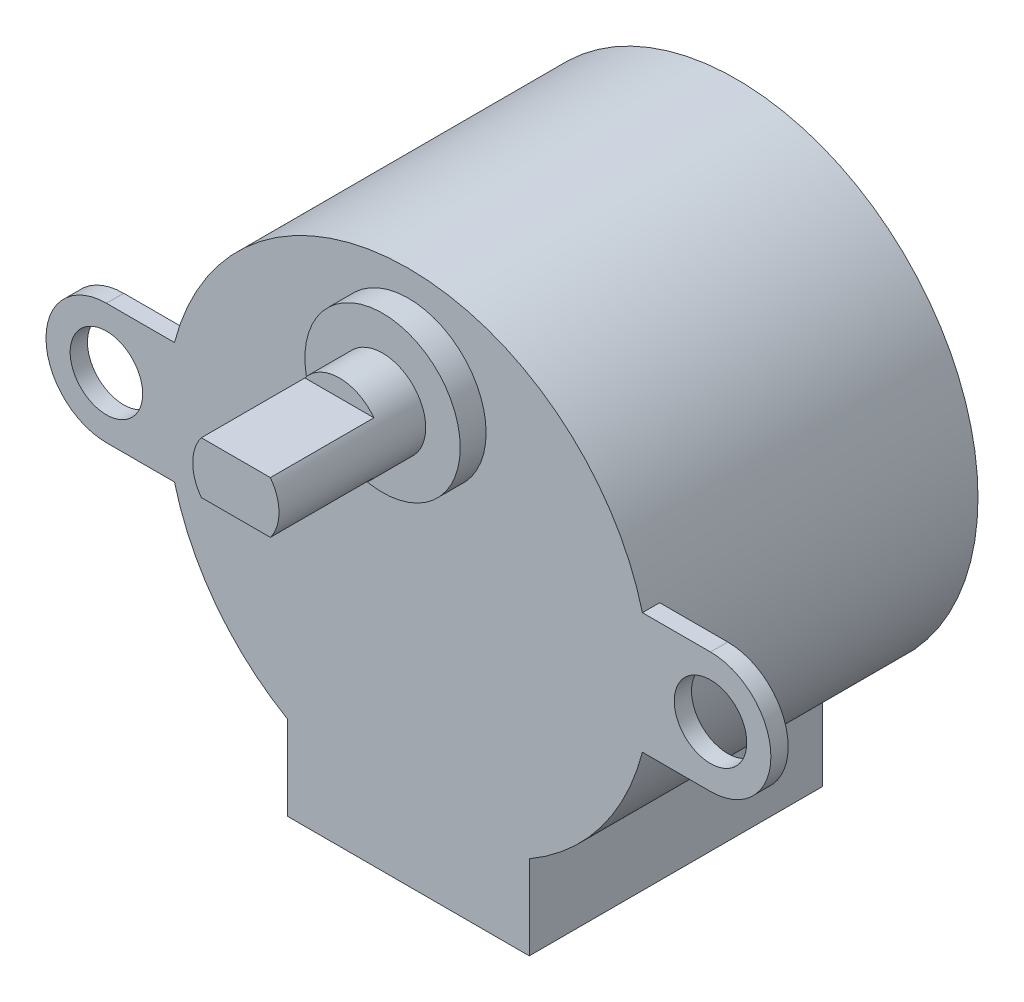
ISO-10303-21;
HEADER;
FILE_DESCRIPTION(('STEP AP214'),'2;1');
FILE_NAME('part.step','',(''),(''),'','','');
FILE_SCHEMA(('AUTOMOTIVE_DESIGN { 1 0 10303 214 1 1 1 1 }'));
ENDSEC;
DATA;
#1=APPLICATION_CONTEXT('core data for automotive mechanical design processes');
#2=APPLICATION_PROTOCOL_DEFINITION('international standard','automotive_design',2000,#1);
#3=PRODUCT_CONTEXT('',#1,'mechanical');
#4=PRODUCT('Part','Part','',(#3));
#5=PRODUCT_RELATED_PRODUCT_CATEGORY('part','',(#4));
#6=PRODUCT_DEFINITION_FORMATION('','',#4);
#7=PRODUCT_DEFINITION_CONTEXT('part definition',#1,'design');
#8=PRODUCT_DEFINITION('design','',#6,#7);
#9=PRODUCT_DEFINITION_SHAPE('','',#8);
#10=(LENGTH_UNIT() NAMED_UNIT(*) SI_UNIT(.MILLI.,.METRE.));
#11=(NAMED_UNIT(*) PLANE_ANGLE_UNIT() SI_UNIT($,.RADIAN.));
#12=(NAMED_UNIT(*) SI_UNIT($,.STERADIAN.) SOLID_ANGLE_UNIT());
#13=UNCERTAINTY_MEASURE_WITH_UNIT(LENGTH_MEASURE(1.E-05),#10,'distance_accuracy_value','');
#14=(GEOMETRIC_REPRESENTATION_CONTEXT(3) GLOBAL_UNCERTAINTY_ASSIGNED_CONTEXT((#13)) GLOBAL_UNIT_ASSIGNED_CONTEXT((#10,
#11,#12)) REPRESENTATION_CONTEXT('',''));
#15=CARTESIAN_POINT('',(0.,0.,0.));
#16=DIRECTION('',(0.,0.,1.));
#17=DIRECTION('',(1.,0.,0.));
#18=AXIS2_PLACEMENT_3D('',#15,#16,#17);
#19=CARTESIAN_POINT('',(0.,0.,19.));
#20=DIRECTION('',(0.,0.,-1.));
#21=DIRECTION('',(-1.,0.,0.));
#22=AXIS2_PLACEMENT_3D('',#19,#20,#21);
#23=CYLINDRICAL_SURFACE('',#22,14.);
#24=CARTESIAN_POINT('',(0.,0.,19.));
#25=DIRECTION('',(0.,0.,1.));
#26=DIRECTION('',(1.,0.,0.));
#27=AXIS2_PLACEMENT_3D('',#24,#25,#26);
#28=CIRCLE('',#27,14.);
#29=CARTESIAN_POINT('',(-13.555441711726,-3.5,19.));
#30=VERTEX_POINT('',#29);
#31=CARTESIAN_POINT('',(-7.,-12.1243556529821,19.));
#32=VERTEX_POINT('',#31);
#33=EDGE_CURVE('E279',#30,#32,#28,.T.);
#34=ORIENTED_EDGE('',*,*,#33,.F.);
#35=DIRECTION('',(0.,0.,-1.));
#36=VECTOR('',#35,1.);
#37=CARTESIAN_POINT('',(-13.555441711726,-3.5,19.));
#38=LINE('',#37,#36);
#39=CARTESIAN_POINT('',(-13.555441711726,-3.5,18.));
#40=VERTEX_POINT('',#39);
#41=EDGE_CURVE('E206',#30,#40,#38,.T.);
#42=ORIENTED_EDGE('',*,*,#41,.T.);
#43=CARTESIAN_POINT('',(0.,0.,18.));
#44=DIRECTION('',(0.,0.,1.));
#45=DIRECTION('',(1.,0.,0.));
#46=AXIS2_PLACEMENT_3D('',#43,#44,#45);
#47=CIRCLE('',#46,14.);
#48=CARTESIAN_POINT('',(-13.555441711726,3.5,18.));
#49=VERTEX_POINT('',#48);
#50=EDGE_CURVE('E11',#49,#40,#47,.T.);
#51=ORIENTED_EDGE('',*,*,#50,.F.);
#52=DIRECTION('',(0.,0.,-1.));
#53=VECTOR('',#52,1.);
#54=CARTESIAN_POINT('',(-13.555441711726,3.5,19.));
#55=LINE('',#54,#53);
#56=CARTESIAN_POINT('',(-13.555441711726,3.5,19.));
#57=VERTEX_POINT('',#56);
#58=EDGE_CURVE('E194',#49,#57,#55,.F.);
#59=ORIENTED_EDGE('',*,*,#58,.T.);
#60=CARTESIAN_POINT('',(13.555441711726,3.5,19.));
#61=VERTEX_POINT('',#60);
#62=EDGE_CURVE('E278',#61,#57,#28,.T.);
#63=ORIENTED_EDGE('',*,*,#62,.F.);
#64=DIRECTION('',(0.,0.,-1.));
#65=VECTOR('',#64,1.);
#66=CARTESIAN_POINT('',(13.555441711726,3.5,19.));
#67=LINE('',#66,#65);
#68=CARTESIAN_POINT('',(13.555441711726,3.5,18.));
#69=VERTEX_POINT('',#68);
#70=EDGE_CURVE('E201',#61,#69,#67,.T.);
#71=ORIENTED_EDGE('',*,*,#70,.T.);
#72=CARTESIAN_POINT('',(13.555441711726,-3.5,18.));
#73=VERTEX_POINT('',#72);
#74=EDGE_CURVE('E41',#73,#69,#47,.T.);
#75=ORIENTED_EDGE('',*,*,#74,.F.);
#76=DIRECTION('',(0.,0.,-1.));
#77=VECTOR('',#76,1.);
#78=CARTESIAN_POINT('',(13.555441711726,-3.5,19.));
#79=LINE('',#78,#77);
#80=CARTESIAN_POINT('',(13.555441711726,-3.5,19.));
#81=VERTEX_POINT('',#80);
#82=EDGE_CURVE('E203',#73,#81,#79,.F.);
#83=ORIENTED_EDGE('',*,*,#82,.T.);
#84=CARTESIAN_POINT('',(7.,-12.1243556529821,19.));
#85=VERTEX_POINT('',#84);
#86=EDGE_CURVE('E274',#85,#81,#28,.T.);
#87=ORIENTED_EDGE('',*,*,#86,.F.);
#88=DIRECTION('',(0.,0.,-1.));
#89=VECTOR('',#88,1.);
#90=CARTESIAN_POINT('',(7.,-12.1243556529821,19.));
#91=LINE('',#90,#89);
#92=CARTESIAN_POINT('',(7.,-12.1243556529821,1.99999999999999));
#93=VERTEX_POINT('',#92);
#94=EDGE_CURVE('E232',#93,#85,#91,.F.);
#95=ORIENTED_EDGE('',*,*,#94,.F.);
#96=CARTESIAN_POINT('',(0.,0.,1.99999999999999));
#97=DIRECTION('',(0.,0.,-1.));
#98=DIRECTION('',(-1.,0.,0.));
#99=AXIS2_PLACEMENT_3D('',#96,#97,#98);
#100=CIRCLE('',#99,14.);
#101=CARTESIAN_POINT('',(-7.,-12.1243556529821,1.99999999999999));
#102=VERTEX_POINT('',#101);
#103=EDGE_CURVE('E277',#93,#102,#100,.T.);
#104=ORIENTED_EDGE('',*,*,#103,.T.);
#105=DIRECTION('',(0.,0.,-1.));
#106=VECTOR('',#105,1.);
#107=CARTESIAN_POINT('',(-7.,-12.1243556529821,19.));
#108=LINE('',#107,#106);
#109=EDGE_CURVE('E229',#102,#32,#108,.F.);
#110=ORIENTED_EDGE('',*,*,#109,.T.);
#111=EDGE_LOOP('',(#34,#42,#51,#59,#63,#71,#75,#83,#87,#95,#104,#110));
#112=FACE_BOUND('',#111,.T.);
#113=CARTESIAN_POINT('',(0.,0.,0.));
#114=DIRECTION('',(0.,0.,1.));
#115=DIRECTION('',(1.,0.,0.));
#116=AXIS2_PLACEMENT_3D('',#113,#114,#115);
#117=CIRCLE('',#116,14.);
#118=CARTESIAN_POINT('',(14.,0.,0.));
#119=VERTEX_POINT('',#118);
#120=EDGE_CURVE('E272',#119,#119,#117,.T.);
#121=ORIENTED_EDGE('',*,*,#120,.T.);
#122=EDGE_LOOP('',(#121));
#123=FACE_BOUND('',#122,.T.);
#124=ADVANCED_FACE('F38',(#112,#123),#23,.T.);
#125=CARTESIAN_POINT('',(0.,0.,23.));
#126=DIRECTION('',(0.,0.,1.));
#127=DIRECTION('',(1.,0.,0.));
#128=AXIS2_PLACEMENT_3D('',#125,#126,#127);
#129=PLANE('',#128);
#130=CARTESIAN_POINT('',(0.,8.,23.));
#131=DIRECTION('',(0.,0.,1.));
#132=DIRECTION('',(1.,0.,0.));
#133=AXIS2_PLACEMENT_3D('',#130,#131,#132);
#134=CIRCLE('',#133,2.5);
#135=CARTESIAN_POINT('',(2.,9.5,23.));
#136=VERTEX_POINT('',#135);
#137=CARTESIAN_POINT('',(-2.,9.5,23.));
#138=VERTEX_POINT('',#137);
#139=EDGE_CURVE('E270',#136,#138,#134,.T.);
#140=ORIENTED_EDGE('',*,*,#139,.T.);
#141=DIRECTION('',(1.,0.,0.));
#142=VECTOR('',#141,1.);
#143=CARTESIAN_POINT('',(-2.,9.5,23.));
#144=LINE('',#143,#142);
#145=EDGE_CURVE('E240',#138,#136,#144,.T.);
#146=ORIENTED_EDGE('',*,*,#145,.T.);
#147=EDGE_LOOP('',(#140,#146));
#148=FACE_BOUND('',#147,.T.);
#149=ADVANCED_FACE('F335',(#148),#129,.T.);
#150=CARTESIAN_POINT('',(0.,0.,19.));
#151=DIRECTION('',(0.,0.,1.));
#152=DIRECTION('',(1.,0.,0.));
#153=AXIS2_PLACEMENT_3D('',#150,#151,#152);
#154=PLANE('',#153);
#155=CARTESIAN_POINT('',(0.,8.,19.));
#156=DIRECTION('',(0.,0.,1.));
#157=DIRECTION('',(1.,0.,0.));
#158=AXIS2_PLACEMENT_3D('',#155,#156,#157);
#159=CIRCLE('',#158,4.5);
#160=CARTESIAN_POINT('',(4.5,8.,19.));
#161=VERTEX_POINT('',#160);
#162=EDGE_CURVE('E263',#161,#161,#159,.T.);
#163=ORIENTED_EDGE('',*,*,#162,.F.);
#164=EDGE_LOOP('',(#163));
#165=FACE_BOUND('',#164,.T.);
#166=ORIENTED_EDGE('',*,*,#86,.T.);
#167=DIRECTION('',(1.,0.,0.));
#168=VECTOR('',#167,1.);
#169=CARTESIAN_POINT('',(-17.5,-3.5,19.));
#170=LINE('',#169,#168);
#171=CARTESIAN_POINT('',(17.5,-3.5,19.));
#172=VERTEX_POINT('',#171);
#173=EDGE_CURVE('E175',#81,#172,#170,.T.);
#174=ORIENTED_EDGE('',*,*,#173,.T.);
#175=CARTESIAN_POINT('',(17.5,0.,19.));
#176=DIRECTION('',(0.,0.,1.));
#177=DIRECTION('',(1.,0.,0.));
#178=AXIS2_PLACEMENT_3D('',#175,#176,#177);
#179=CIRCLE('',#178,3.5);
#180=CARTESIAN_POINT('',(17.5,3.5,19.));
#181=VERTEX_POINT('',#180);
#182=EDGE_CURVE('E186',#172,#181,#179,.T.);
#183=ORIENTED_EDGE('',*,*,#182,.T.);
#184=DIRECTION('',(-1.,0.,0.));
#185=VECTOR('',#184,1.);
#186=CARTESIAN_POINT('',(-17.5,3.5,19.));
#187=LINE('',#186,#185);
#188=EDGE_CURVE('E59',#181,#61,#187,.T.);
#189=ORIENTED_EDGE('',*,*,#188,.T.);
#190=ORIENTED_EDGE('',*,*,#62,.T.);
#191=CARTESIAN_POINT('',(-17.5,3.5,19.));
#192=VERTEX_POINT('',#191);
#193=EDGE_CURVE('E188',#57,#192,#187,.T.);
#194=ORIENTED_EDGE('',*,*,#193,.T.);
#195=CARTESIAN_POINT('',(-17.5,0.,19.));
#196=DIRECTION('',(0.,0.,1.));
#197=DIRECTION('',(1.,0.,0.));
#198=AXIS2_PLACEMENT_3D('',#195,#196,#197);
#199=CIRCLE('',#198,3.5);
#200=CARTESIAN_POINT('',(-17.5,-3.5,19.));
#201=VERTEX_POINT('',#200);
#202=EDGE_CURVE('E191',#192,#201,#199,.T.);
#203=ORIENTED_EDGE('',*,*,#202,.T.);
#204=EDGE_CURVE('E52',#201,#30,#170,.T.);
#205=ORIENTED_EDGE('',*,*,#204,.T.);
#206=ORIENTED_EDGE('',*,*,#33,.T.);
#207=DIRECTION('',(0.,-1.,0.));
#208=VECTOR('',#207,1.);
#209=CARTESIAN_POINT('',(-7.,0.,19.));
#210=LINE('',#209,#208);
#211=CARTESIAN_POINT('',(-7.,-17.,19.));
#212=VERTEX_POINT('',#211);
#213=EDGE_CURVE('E213',#32,#212,#210,.T.);
#214=ORIENTED_EDGE('',*,*,#213,.T.);
#215=DIRECTION('',(1.,0.,0.));
#216=VECTOR('',#215,1.);
#217=CARTESIAN_POINT('',(-7.,-17.,19.));
#218=LINE('',#217,#216);
#219=CARTESIAN_POINT('',(7.,-17.,19.));
#220=VERTEX_POINT('',#219);
#221=EDGE_CURVE('E220',#212,#220,#218,.T.);
#222=ORIENTED_EDGE('',*,*,#221,.T.);
#223=DIRECTION('',(0.,-1.,0.));
#224=VECTOR('',#223,1.);
#225=CARTESIAN_POINT('',(7.,0.,19.));
#226=LINE('',#225,#224);
#227=EDGE_CURVE('E209',#85,#220,#226,.T.);
#228=ORIENTED_EDGE('',*,*,#227,.F.);
#229=EDGE_LOOP('',(#166,#174,#183,#189,#190,#194,#203,#205,#206,#214,#222,#228));
#230=FACE_BOUND('',#229,.T.);
#231=CARTESIAN_POINT('',(17.5,0.,19.));
#232=DIRECTION('',(0.,0.,1.));
#233=DIRECTION('',(1.,0.,0.));
#234=AXIS2_PLACEMENT_3D('',#231,#232,#233);
#235=CIRCLE('',#234,2.1);
#236=CARTESIAN_POINT('',(19.6,0.,19.));
#237=VERTEX_POINT('',#236);
#238=EDGE_CURVE('E500',#237,#237,#235,.T.);
#239=ORIENTED_EDGE('',*,*,#238,.F.);
#240=EDGE_LOOP('',(#239));
#241=FACE_BOUND('',#240,.T.);
#242=CARTESIAN_POINT('',(-17.5,0.,19.));
#243=DIRECTION('',(0.,0.,1.));
#244=DIRECTION('',(1.,0.,0.));
#245=AXIS2_PLACEMENT_3D('',#242,#243,#244);
#246=CIRCLE('',#245,2.1);
#247=CARTESIAN_POINT('',(-15.4,0.,19.));
#248=VERTEX_POINT('',#247);
#249=EDGE_CURVE('E178',#248,#248,#246,.T.);
#250=ORIENTED_EDGE('',*,*,#249,.F.);
#251=EDGE_LOOP('',(#250));
#252=FACE_BOUND('',#251,.T.);
#253=ADVANCED_FACE('F304',(#165,#230,#241,#252),#154,.T.);
#254=CARTESIAN_POINT('',(0.,0.,0.));
#255=DIRECTION('',(0.,0.,1.));
#256=DIRECTION('',(1.,0.,0.));
#257=AXIS2_PLACEMENT_3D('',#254,#255,#256);
#258=PLANE('',#257);
#259=ORIENTED_EDGE('',*,*,#120,.F.);
#260=EDGE_LOOP('',(#259));
#261=FACE_BOUND('',#260,.T.);
#262=ADVANCED_FACE('F345',(#261),#258,.F.);
#263=CARTESIAN_POINT('',(0.,8.,20.5));
#264=DIRECTION('',(0.,0.,-1.));
#265=DIRECTION('',(-1.,0.,0.));
#266=AXIS2_PLACEMENT_3D('',#263,#264,#265);
#267=CYLINDRICAL_SURFACE('',#266,4.5);
#268=CARTESIAN_POINT('',(0.,8.,20.5));
#269=DIRECTION('',(0.,0.,1.));
#270=DIRECTION('',(1.,0.,0.));
#271=AXIS2_PLACEMENT_3D('',#268,#269,#270);
#272=CIRCLE('',#271,4.5);
#273=CARTESIAN_POINT('',(4.5,8.,20.5));
#274=VERTEX_POINT('',#273);
#275=EDGE_CURVE('E264',#274,#274,#272,.T.);
#276=ORIENTED_EDGE('',*,*,#275,.F.);
#277=EDGE_LOOP('',(#276));
#278=FACE_BOUND('',#277,.T.);
#279=ORIENTED_EDGE('',*,*,#162,.T.);
#280=EDGE_LOOP('',(#279));
#281=FACE_BOUND('',#280,.T.);
#282=ADVANCED_FACE('F360',(#278,#281),#267,.T.);
#283=CARTESIAN_POINT('',(0.,8.,20.5));
#284=DIRECTION('',(0.,0.,1.));
#285=DIRECTION('',(1.,0.,0.));
#286=AXIS2_PLACEMENT_3D('',#283,#284,#285);
#287=PLANE('',#286);
#288=CARTESIAN_POINT('',(0.,8.,20.5));
#289=DIRECTION('',(0.,0.,1.));
#290=DIRECTION('',(1.,0.,0.));
#291=AXIS2_PLACEMENT_3D('',#288,#289,#290);
#292=CIRCLE('',#291,2.5);
#293=CARTESIAN_POINT('',(2.5,8.,20.5));
#294=VERTEX_POINT('',#293);
#295=EDGE_CURVE('E267',#294,#294,#292,.T.);
#296=ORIENTED_EDGE('',*,*,#295,.F.);
#297=EDGE_LOOP('',(#296));
#298=FACE_BOUND('',#297,.T.);
#299=ORIENTED_EDGE('',*,*,#275,.T.);
#300=EDGE_LOOP('',(#299));
#301=FACE_BOUND('',#300,.T.);
#302=ADVANCED_FACE('F352',(#298,#301),#287,.T.);
#303=DIRECTION('',(1.,0.,0.));
#304=VECTOR('',#303,1.);
#305=CARTESIAN_POINT('',(-2.,6.5,23.));
#306=LINE('',#305,#304);
#307=CARTESIAN_POINT('',(-2.,6.5,23.));
#308=VERTEX_POINT('',#307);
#309=CARTESIAN_POINT('',(2.,6.5,23.));
#310=VERTEX_POINT('',#309);
#311=EDGE_CURVE('E235',#308,#310,#306,.T.);
#312=ORIENTED_EDGE('',*,*,#311,.F.);
#313=EDGE_CURVE('E273',#308,#310,#134,.T.);
#314=ORIENTED_EDGE('',*,*,#313,.T.);
#315=EDGE_LOOP('',(#312,#314));
#316=FACE_BOUND('',#315,.T.);
#317=ADVANCED_FACE('F341',(#316),#129,.T.);
#318=CARTESIAN_POINT('',(0.,8.,23.));
#319=DIRECTION('',(0.,0.,-1.));
#320=DIRECTION('',(-1.,0.,0.));
#321=AXIS2_PLACEMENT_3D('',#318,#319,#320);
#322=CYLINDRICAL_SURFACE('',#321,2.5);
#323=ORIENTED_EDGE('',*,*,#295,.T.);
#324=EDGE_LOOP('',(#323));
#325=FACE_BOUND('',#324,.T.);
#326=ORIENTED_EDGE('',*,*,#139,.F.);
#327=DIRECTION('',(0.,0.,-1.));
#328=VECTOR('',#327,1.);
#329=CARTESIAN_POINT('',(2.,9.5,29.));
#330=LINE('',#329,#328);
#331=CARTESIAN_POINT('',(2.,9.5,29.));
#332=VERTEX_POINT('',#331);
#333=EDGE_CURVE('E254',#332,#136,#330,.T.);
#334=ORIENTED_EDGE('',*,*,#333,.F.);
#335=CARTESIAN_POINT('',(0.,8.,29.));
#336=DIRECTION('',(0.,0.,-1.));
#337=DIRECTION('',(-1.,0.,0.));
#338=AXIS2_PLACEMENT_3D('',#335,#336,#337);
#339=CIRCLE('',#338,2.5);
#340=CARTESIAN_POINT('',(2.,6.5,29.));
#341=VERTEX_POINT('',#340);
#342=EDGE_CURVE('E242',#332,#341,#339,.T.);
#343=ORIENTED_EDGE('',*,*,#342,.T.);
#344=DIRECTION('',(0.,0.,-1.));
#345=VECTOR('',#344,1.);
#346=CARTESIAN_POINT('',(2.,6.5,29.));
#347=LINE('',#346,#345);
#348=EDGE_CURVE('E257',#341,#310,#347,.T.);
#349=ORIENTED_EDGE('',*,*,#348,.T.);
#350=ORIENTED_EDGE('',*,*,#313,.F.);
#351=DIRECTION('',(0.,0.,-1.));
#352=VECTOR('',#351,1.);
#353=CARTESIAN_POINT('',(-2.,6.5,29.));
#354=LINE('',#353,#352);
#355=CARTESIAN_POINT('',(-2.,6.5,29.));
#356=VERTEX_POINT('',#355);
#357=EDGE_CURVE('E260',#356,#308,#354,.T.);
#358=ORIENTED_EDGE('',*,*,#357,.F.);
#359=CARTESIAN_POINT('',(0.,8.,29.));
#360=DIRECTION('',(0.,0.,1.));
#361=DIRECTION('',(1.,0.,0.));
#362=AXIS2_PLACEMENT_3D('',#359,#360,#361);
#363=CIRCLE('',#362,2.50000000000001);
#364=CARTESIAN_POINT('',(-2.,9.5,29.));
#365=VERTEX_POINT('',#364);
#366=EDGE_CURVE('E236',#365,#356,#363,.T.);
#367=ORIENTED_EDGE('',*,*,#366,.F.);
#368=DIRECTION('',(0.,0.,-1.));
#369=VECTOR('',#368,1.);
#370=CARTESIAN_POINT('',(-2.,9.5,29.));
#371=LINE('',#370,#369);
#372=EDGE_CURVE('E248',#365,#138,#371,.T.);
#373=ORIENTED_EDGE('',*,*,#372,.T.);
#374=EDGE_LOOP('',(#326,#334,#343,#349,#350,#358,#367,#373));
#375=FACE_BOUND('',#374,.T.);
#376=ADVANCED_FACE('F351',(#325,#375),#322,.T.);
#377=CARTESIAN_POINT('',(-2.,6.5,29.));
#378=DIRECTION('',(0.,1.,0.));
#379=DIRECTION('',(0.,0.,1.));
#380=AXIS2_PLACEMENT_3D('',#377,#378,#379);
#381=PLANE('',#380);
#382=ORIENTED_EDGE('',*,*,#311,.T.);
#383=ORIENTED_EDGE('',*,*,#348,.F.);
#384=DIRECTION('',(1.,0.,0.));
#385=VECTOR('',#384,1.);
#386=CARTESIAN_POINT('',(-2.,6.5,29.));
#387=LINE('',#386,#385);
#388=EDGE_CURVE('E239',#356,#341,#387,.T.);
#389=ORIENTED_EDGE('',*,*,#388,.F.);
#390=ORIENTED_EDGE('',*,*,#357,.T.);
#391=EDGE_LOOP('',(#382,#383,#389,#390));
#392=FACE_BOUND('',#391,.T.);
#393=ADVANCED_FACE('F358',(#392),#381,.F.);
#394=CARTESIAN_POINT('',(-2.,9.5,29.));
#395=DIRECTION('',(0.,1.,0.));
#396=DIRECTION('',(0.,0.,1.));
#397=AXIS2_PLACEMENT_3D('',#394,#395,#396);
#398=PLANE('',#397);
#399=ORIENTED_EDGE('',*,*,#145,.F.);
#400=ORIENTED_EDGE('',*,*,#372,.F.);
#401=DIRECTION('',(1.,0.,0.));
#402=VECTOR('',#401,1.);
#403=CARTESIAN_POINT('',(-2.,9.5,29.));
#404=LINE('',#403,#402);
#405=EDGE_CURVE('E245',#365,#332,#404,.T.);
#406=ORIENTED_EDGE('',*,*,#405,.T.);
#407=ORIENTED_EDGE('',*,*,#333,.T.);
#408=EDGE_LOOP('',(#399,#400,#406,#407));
#409=FACE_BOUND('',#408,.T.);
#410=ADVANCED_FACE('F376',(#409),#398,.T.);
#411=CARTESIAN_POINT('',(0.,8.,29.));
#412=DIRECTION('',(0.,0.,1.));
#413=DIRECTION('',(1.,0.,0.));
#414=AXIS2_PLACEMENT_3D('',#411,#412,#413);
#415=PLANE('',#414);
#416=ORIENTED_EDGE('',*,*,#366,.T.);
#417=ORIENTED_EDGE('',*,*,#388,.T.);
#418=ORIENTED_EDGE('',*,*,#342,.F.);
#419=ORIENTED_EDGE('',*,*,#405,.F.);
#420=EDGE_LOOP('',(#416,#417,#418,#419));
#421=FACE_BOUND('',#420,.T.);
#422=ADVANCED_FACE('F373',(#421),#415,.T.);
#423=CARTESIAN_POINT('',(7.,0.,1.99999999999999));
#424=DIRECTION('',(-1.,0.,0.));
#425=DIRECTION('',(0.,-1.,0.));
#426=AXIS2_PLACEMENT_3D('',#423,#424,#425);
#427=PLANE('',#426);
#428=DIRECTION('',(0.,-1.,0.));
#429=VECTOR('',#428,1.);
#430=CARTESIAN_POINT('',(7.,0.,1.99999999999999));
#431=LINE('',#430,#429);
#432=CARTESIAN_POINT('',(7.,-17.,1.99999999999999));
#433=VERTEX_POINT('',#432);
#434=EDGE_CURVE('E210',#93,#433,#431,.T.);
#435=ORIENTED_EDGE('',*,*,#434,.F.);
#436=ORIENTED_EDGE('',*,*,#94,.T.);
#437=ORIENTED_EDGE('',*,*,#227,.T.);
#438=DIRECTION('',(0.,0.,1.));
#439=VECTOR('',#438,1.);
#440=CARTESIAN_POINT('',(7.,-17.,1.99999999999999));
#441=LINE('',#440,#439);
#442=EDGE_CURVE('E226',#433,#220,#441,.T.);
#443=ORIENTED_EDGE('',*,*,#442,.F.);
#444=EDGE_LOOP('',(#435,#436,#437,#443));
#445=FACE_BOUND('',#444,.T.);
#446=ADVANCED_FACE('F296',(#445),#427,.F.);
#447=CARTESIAN_POINT('',(-7.,0.,1.99999999999999));
#448=DIRECTION('',(-1.,0.,0.));
#449=DIRECTION('',(0.,-1.,0.));
#450=AXIS2_PLACEMENT_3D('',#447,#448,#449);
#451=PLANE('',#450);
#452=ORIENTED_EDGE('',*,*,#109,.F.);
#453=DIRECTION('',(0.,-1.,0.));
#454=VECTOR('',#453,1.);
#455=CARTESIAN_POINT('',(-7.,0.,1.99999999999999));
#456=LINE('',#455,#454);
#457=CARTESIAN_POINT('',(-7.,-17.,1.99999999999999));
#458=VERTEX_POINT('',#457);
#459=EDGE_CURVE('E216',#102,#458,#456,.T.);
#460=ORIENTED_EDGE('',*,*,#459,.T.);
#461=DIRECTION('',(0.,0.,1.));
#462=VECTOR('',#461,1.);
#463=CARTESIAN_POINT('',(-7.,-17.,1.99999999999999));
#464=LINE('',#463,#462);
#465=EDGE_CURVE('E218',#458,#212,#464,.T.);
#466=ORIENTED_EDGE('',*,*,#465,.T.);
#467=ORIENTED_EDGE('',*,*,#213,.F.);
#468=EDGE_LOOP('',(#452,#460,#466,#467));
#469=FACE_BOUND('',#468,.T.);
#470=ADVANCED_FACE('F303',(#469),#451,.T.);
#471=CARTESIAN_POINT('',(-7.,-17.,1.99999999999999));
#472=DIRECTION('',(0.,-1.,0.));
#473=DIRECTION('',(0.,0.,-1.));
#474=AXIS2_PLACEMENT_3D('',#471,#472,#473);
#475=PLANE('',#474);
#476=ORIENTED_EDGE('',*,*,#221,.F.);
#477=ORIENTED_EDGE('',*,*,#465,.F.);
#478=DIRECTION('',(1.,0.,0.));
#479=VECTOR('',#478,1.);
#480=CARTESIAN_POINT('',(-7.,-17.,1.99999999999999));
#481=LINE('',#480,#479);
#482=EDGE_CURVE('E212',#458,#433,#481,.T.);
#483=ORIENTED_EDGE('',*,*,#482,.T.);
#484=ORIENTED_EDGE('',*,*,#442,.T.);
#485=EDGE_LOOP('',(#476,#477,#483,#484));
#486=FACE_BOUND('',#485,.T.);
#487=ADVANCED_FACE('F300',(#486),#475,.T.);
#488=CARTESIAN_POINT('',(0.,0.,1.99999999999999));
#489=DIRECTION('',(0.,0.,-1.));
#490=DIRECTION('',(-1.,0.,0.));
#491=AXIS2_PLACEMENT_3D('',#488,#489,#490);
#492=PLANE('',#491);
#493=ORIENTED_EDGE('',*,*,#103,.F.);
#494=ORIENTED_EDGE('',*,*,#434,.T.);
#495=ORIENTED_EDGE('',*,*,#482,.F.);
#496=ORIENTED_EDGE('',*,*,#459,.F.);
#497=EDGE_LOOP('',(#493,#494,#495,#496));
#498=FACE_BOUND('',#497,.T.);
#499=ADVANCED_FACE('F292',(#498),#492,.T.);
#500=CARTESIAN_POINT('',(17.5,0.,18.));
#501=DIRECTION('',(0.,0.,1.));
#502=DIRECTION('',(1.,0.,0.));
#503=AXIS2_PLACEMENT_3D('',#500,#501,#502);
#504=CYLINDRICAL_SURFACE('',#503,2.1);
#505=CARTESIAN_POINT('',(17.5,0.,18.));
#506=DIRECTION('',(0.,0.,1.));
#507=DIRECTION('',(1.,0.,0.));
#508=AXIS2_PLACEMENT_3D('',#505,#506,#507);
#509=CIRCLE('',#508,2.1);
#510=CARTESIAN_POINT('',(19.6,0.,18.));
#511=VERTEX_POINT('',#510);
#512=EDGE_CURVE('E498',#511,#511,#509,.T.);
#513=ORIENTED_EDGE('',*,*,#512,.F.);
#514=EDGE_LOOP('',(#513));
#515=FACE_BOUND('',#514,.T.);
#516=ORIENTED_EDGE('',*,*,#238,.T.);
#517=EDGE_LOOP('',(#516));
#518=FACE_BOUND('',#517,.T.);
#519=ADVANCED_FACE('F421',(#515,#518),#504,.F.);
#520=CARTESIAN_POINT('',(17.5,0.,18.));
#521=DIRECTION('',(0.,0.,1.));
#522=DIRECTION('',(1.,0.,0.));
#523=AXIS2_PLACEMENT_3D('',#520,#521,#522);
#524=CYLINDRICAL_SURFACE('',#523,3.5);
#525=ORIENTED_EDGE('',*,*,#182,.F.);
#526=DIRECTION('',(0.,0.,1.));
#527=VECTOR('',#526,1.);
#528=CARTESIAN_POINT('',(17.5,-3.5,18.));
#529=LINE('',#528,#527);
#530=CARTESIAN_POINT('',(17.5,-3.5,18.));
#531=VERTEX_POINT('',#530);
#532=EDGE_CURVE('E173',#531,#172,#529,.T.);
#533=ORIENTED_EDGE('',*,*,#532,.F.);
#534=CARTESIAN_POINT('',(17.5,0.,18.));
#535=DIRECTION('',(0.,0.,1.));
#536=DIRECTION('',(1.,0.,0.));
#537=AXIS2_PLACEMENT_3D('',#534,#535,#536);
#538=CIRCLE('',#537,3.5);
#539=CARTESIAN_POINT('',(17.5,3.5,18.));
#540=VERTEX_POINT('',#539);
#541=EDGE_CURVE('E165',#531,#540,#538,.T.);
#542=ORIENTED_EDGE('',*,*,#541,.T.);
#543=DIRECTION('',(0.,0.,1.));
#544=VECTOR('',#543,1.);
#545=CARTESIAN_POINT('',(17.5,3.5,18.));
#546=LINE('',#545,#544);
#547=EDGE_CURVE('E150',#540,#181,#546,.T.);
#548=ORIENTED_EDGE('',*,*,#547,.T.);
#549=EDGE_LOOP('',(#525,#533,#542,#548));
#550=FACE_BOUND('',#549,.T.);
#551=ADVANCED_FACE('F171',(#550),#524,.T.);
#552=CARTESIAN_POINT('',(17.5,0.,18.));
#553=DIRECTION('',(0.,0.,1.));
#554=DIRECTION('',(1.,0.,0.));
#555=AXIS2_PLACEMENT_3D('',#552,#553,#554);
#556=PLANE('',#555);
#557=ORIENTED_EDGE('',*,*,#512,.T.);
#558=EDGE_LOOP('',(#557));
#559=FACE_BOUND('',#558,.T.);
#560=DIRECTION('',(1.,0.,0.));
#561=VECTOR('',#560,1.);
#562=CARTESIAN_POINT('',(-17.5,-3.5,18.));
#563=LINE('',#562,#561);
#564=EDGE_CURVE('E183',#73,#531,#563,.T.);
#565=ORIENTED_EDGE('',*,*,#564,.F.);
#566=ORIENTED_EDGE('',*,*,#74,.T.);
#567=DIRECTION('',(-1.,0.,0.));
#568=VECTOR('',#567,1.);
#569=CARTESIAN_POINT('',(-17.5,3.5,18.));
#570=LINE('',#569,#568);
#571=EDGE_CURVE('E153',#540,#69,#570,.T.);
#572=ORIENTED_EDGE('',*,*,#571,.F.);
#573=ORIENTED_EDGE('',*,*,#541,.F.);
#574=EDGE_LOOP('',(#565,#566,#572,#573));
#575=FACE_BOUND('',#574,.T.);
#576=ADVANCED_FACE('F164',(#559,#575),#556,.F.);
#577=CARTESIAN_POINT('',(-17.5,3.5,18.));
#578=DIRECTION('',(0.,1.,0.));
#579=DIRECTION('',(0.,0.,1.));
#580=AXIS2_PLACEMENT_3D('',#577,#578,#579);
#581=PLANE('',#580);
#582=ORIENTED_EDGE('',*,*,#70,.F.);
#583=ORIENTED_EDGE('',*,*,#188,.F.);
#584=ORIENTED_EDGE('',*,*,#547,.F.);
#585=ORIENTED_EDGE('',*,*,#571,.T.);
#586=EDGE_LOOP('',(#582,#583,#584,#585));
#587=FACE_BOUND('',#586,.T.);
#588=ADVANCED_FACE('F152',(#587),#581,.T.);
#589=CARTESIAN_POINT('',(-17.5,-3.5,18.));
#590=DIRECTION('',(0.,-1.,0.));
#591=DIRECTION('',(0.,0.,-1.));
#592=AXIS2_PLACEMENT_3D('',#589,#590,#591);
#593=PLANE('',#592);
#594=ORIENTED_EDGE('',*,*,#82,.F.);
#595=ORIENTED_EDGE('',*,*,#564,.T.);
#596=ORIENTED_EDGE('',*,*,#532,.T.);
#597=ORIENTED_EDGE('',*,*,#173,.F.);
#598=EDGE_LOOP('',(#594,#595,#596,#597));
#599=FACE_BOUND('',#598,.T.);
#600=ADVANCED_FACE('F323',(#599),#593,.T.);
#601=CARTESIAN_POINT('',(-17.5,0.,18.));
#602=DIRECTION('',(0.,0.,1.));
#603=DIRECTION('',(1.,0.,0.));
#604=AXIS2_PLACEMENT_3D('',#601,#602,#603);
#605=CIRCLE('',#604,2.1);
#606=CARTESIAN_POINT('',(-15.4,0.,18.));
#607=VERTEX_POINT('',#606);
#608=EDGE_CURVE('E189',#607,#607,#605,.T.);
#609=ORIENTED_EDGE('',*,*,#608,.T.);
#610=EDGE_LOOP('',(#609));
#611=FACE_BOUND('',#610,.T.);
#612=CARTESIAN_POINT('',(-17.5,3.5,18.));
#613=VERTEX_POINT('',#612);
#614=EDGE_CURVE('E168',#49,#613,#570,.T.);
#615=ORIENTED_EDGE('',*,*,#614,.F.);
#616=ORIENTED_EDGE('',*,*,#50,.T.);
#617=CARTESIAN_POINT('',(-17.5,-3.5,18.));
#618=VERTEX_POINT('',#617);
#619=EDGE_CURVE('E159',#618,#40,#563,.T.);
#620=ORIENTED_EDGE('',*,*,#619,.F.);
#621=CARTESIAN_POINT('',(-17.5,0.,18.));
#622=DIRECTION('',(0.,0.,1.));
#623=DIRECTION('',(1.,0.,0.));
#624=AXIS2_PLACEMENT_3D('',#621,#622,#623);
#625=CIRCLE('',#624,3.5);
#626=EDGE_CURVE('E167',#613,#618,#625,.T.);
#627=ORIENTED_EDGE('',*,*,#626,.F.);
#628=EDGE_LOOP('',(#615,#616,#620,#627));
#629=FACE_BOUND('',#628,.T.);
#630=ADVANCED_FACE('F314',(#611,#629),#556,.F.);
#631=ORIENTED_EDGE('',*,*,#41,.F.);
#632=ORIENTED_EDGE('',*,*,#204,.F.);
#633=DIRECTION('',(0.,0.,1.));
#634=VECTOR('',#633,1.);
#635=CARTESIAN_POINT('',(-17.5,-3.5,18.));
#636=LINE('',#635,#634);
#637=EDGE_CURVE('E195',#618,#201,#636,.T.);
#638=ORIENTED_EDGE('',*,*,#637,.F.);
#639=ORIENTED_EDGE('',*,*,#619,.T.);
#640=EDGE_LOOP('',(#631,#632,#638,#639));
#641=FACE_BOUND('',#640,.T.);
#642=ADVANCED_FACE('F320',(#641),#593,.T.);
#643=ORIENTED_EDGE('',*,*,#58,.F.);
#644=ORIENTED_EDGE('',*,*,#614,.T.);
#645=DIRECTION('',(0.,0.,1.));
#646=VECTOR('',#645,1.);
#647=CARTESIAN_POINT('',(-17.5,3.5,18.));
#648=LINE('',#647,#646);
#649=EDGE_CURVE('E158',#613,#192,#648,.T.);
#650=ORIENTED_EDGE('',*,*,#649,.T.);
#651=ORIENTED_EDGE('',*,*,#193,.F.);
#652=EDGE_LOOP('',(#643,#644,#650,#651));
#653=FACE_BOUND('',#652,.T.);
#654=ADVANCED_FACE('F310',(#653),#581,.T.);
#655=CARTESIAN_POINT('',(-17.5,0.,18.));
#656=DIRECTION('',(0.,0.,1.));
#657=DIRECTION('',(1.,0.,0.));
#658=AXIS2_PLACEMENT_3D('',#655,#656,#657);
#659=CYLINDRICAL_SURFACE('',#658,3.5);
#660=ORIENTED_EDGE('',*,*,#202,.F.);
#661=ORIENTED_EDGE('',*,*,#649,.F.);
#662=ORIENTED_EDGE('',*,*,#626,.T.);
#663=ORIENTED_EDGE('',*,*,#637,.T.);
#664=EDGE_LOOP('',(#660,#661,#662,#663));
#665=FACE_BOUND('',#664,.T.);
#666=ADVANCED_FACE('F318',(#665),#659,.T.);
#667=CARTESIAN_POINT('',(-17.5,0.,18.));
#668=DIRECTION('',(0.,0.,1.));
#669=DIRECTION('',(1.,0.,0.));
#670=AXIS2_PLACEMENT_3D('',#667,#668,#669);
#671=CYLINDRICAL_SURFACE('',#670,2.1);
#672=ORIENTED_EDGE('',*,*,#608,.F.);
#673=EDGE_LOOP('',(#672));
#674=FACE_BOUND('',#673,.T.);
#675=ORIENTED_EDGE('',*,*,#249,.T.);
#676=EDGE_LOOP('',(#675));
#677=FACE_BOUND('',#676,.T.);
#678=ADVANCED_FACE('F480',(#674,#677),#671,.F.);
#679=CLOSED_SHELL('',(#124,#149,#253,#262,#282,#302,#317,#376,#393,#410,#422,#446,#470,#487,
#499,#519,#551,#576,#588,#600,#630,#642,#654,#666,#678));
#680=MANIFOLD_SOLID_BREP('B2',#679);
#681=ADVANCED_BREP_SHAPE_REPRESENTATION('',(#18,#680),#14);
#682=SHAPE_DEFINITION_REPRESENTATION(#9,#681);
ENDSEC;
END-ISO-10303-21;
